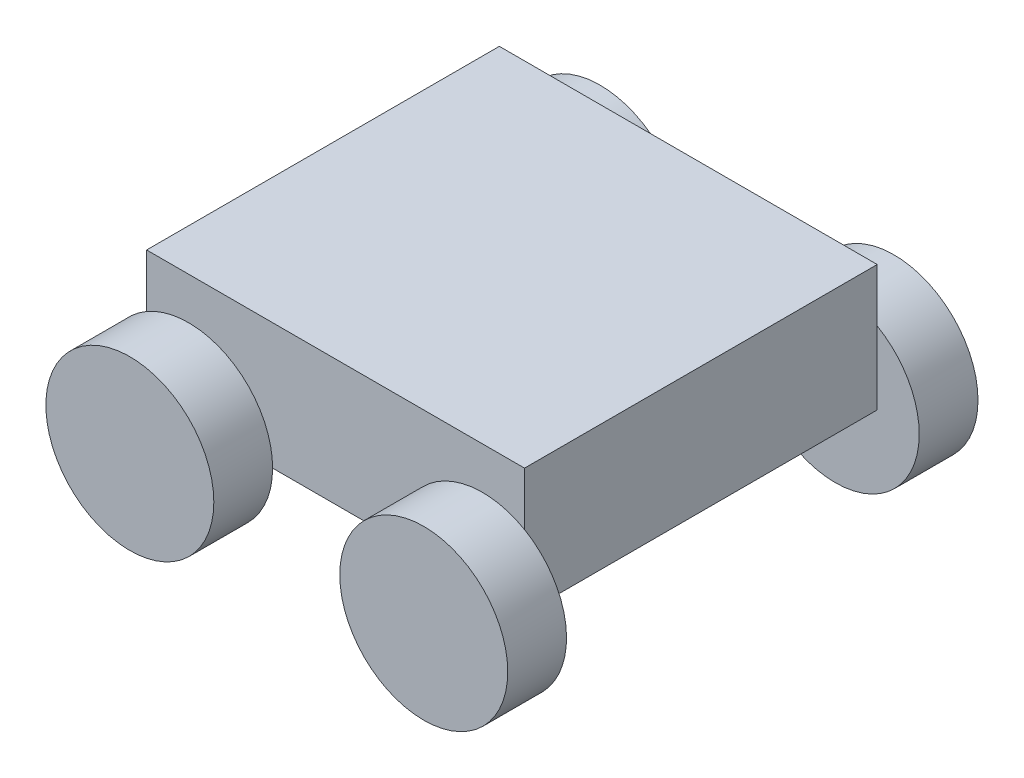
ISO-10303-21;
HEADER;
FILE_DESCRIPTION(('STEP AP214'),'2;1');
FILE_NAME('part.step','',(''),(''),'','','');
FILE_SCHEMA(('AUTOMOTIVE_DESIGN { 1 0 10303 214 1 1 1 1 }'));
ENDSEC;
DATA;
#1=APPLICATION_CONTEXT('core data for automotive mechanical design processes');
#2=APPLICATION_PROTOCOL_DEFINITION('international standard','automotive_design',2000,#1);
#3=PRODUCT_CONTEXT('',#1,'mechanical');
#4=PRODUCT('Part','Part','',(#3));
#5=PRODUCT_RELATED_PRODUCT_CATEGORY('part','',(#4));
#6=PRODUCT_DEFINITION_FORMATION('','',#4);
#7=PRODUCT_DEFINITION_CONTEXT('part definition',#1,'design');
#8=PRODUCT_DEFINITION('design','',#6,#7);
#9=PRODUCT_DEFINITION_SHAPE('','',#8);
#10=(LENGTH_UNIT() NAMED_UNIT(*) SI_UNIT(.MILLI.,.METRE.));
#11=(NAMED_UNIT(*) PLANE_ANGLE_UNIT() SI_UNIT($,.RADIAN.));
#12=(NAMED_UNIT(*) SI_UNIT($,.STERADIAN.) SOLID_ANGLE_UNIT());
#13=UNCERTAINTY_MEASURE_WITH_UNIT(LENGTH_MEASURE(1.E-05),#10,'distance_accuracy_value','');
#14=(GEOMETRIC_REPRESENTATION_CONTEXT(3) GLOBAL_UNCERTAINTY_ASSIGNED_CONTEXT((#13)) GLOBAL_UNIT_ASSIGNED_CONTEXT((#10,
#11,#12)) REPRESENTATION_CONTEXT('',''));
#15=CARTESIAN_POINT('',(0.,0.,0.));
#16=DIRECTION('',(0.,0.,1.));
#17=DIRECTION('',(1.,0.,0.));
#18=AXIS2_PLACEMENT_3D('',#15,#16,#17);
#19=CARTESIAN_POINT('',(225.,150.,-210.));
#20=DIRECTION('',(-1.,0.,0.));
#21=DIRECTION('',(0.,0.,1.));
#22=AXIS2_PLACEMENT_3D('',#19,#20,#21);
#23=PLANE('',#22);
#24=DIRECTION('',(0.,0.,-1.));
#25=VECTOR('',#24,1.);
#26=CARTESIAN_POINT('',(225.,0.,-210.));
#27=LINE('',#26,#25);
#28=CARTESIAN_POINT('',(225.,0.,210.));
#29=VERTEX_POINT('',#28);
#30=CARTESIAN_POINT('',(225.,0.,-210.));
#31=VERTEX_POINT('',#30);
#32=EDGE_CURVE('E127',#29,#31,#27,.T.);
#33=ORIENTED_EDGE('',*,*,#32,.T.);
#34=DIRECTION('',(0.,-1.,0.));
#35=VECTOR('',#34,1.);
#36=CARTESIAN_POINT('',(225.,150.,-210.));
#37=LINE('',#36,#35);
#38=CARTESIAN_POINT('',(225.,86.602540378444,-210.));
#39=VERTEX_POINT('',#38);
#40=EDGE_CURVE('E53',#39,#31,#37,.T.);
#41=ORIENTED_EDGE('',*,*,#40,.F.);
#42=CARTESIAN_POINT('',(225.,150.,-210.));
#43=VERTEX_POINT('',#42);
#44=EDGE_CURVE('E11',#43,#39,#37,.T.);
#45=ORIENTED_EDGE('',*,*,#44,.F.);
#46=DIRECTION('',(0.,0.,-1.));
#47=VECTOR('',#46,1.);
#48=CARTESIAN_POINT('',(225.,150.,-210.));
#49=LINE('',#48,#47);
#50=CARTESIAN_POINT('',(225.,150.,210.));
#51=VERTEX_POINT('',#50);
#52=EDGE_CURVE('E140',#51,#43,#49,.T.);
#53=ORIENTED_EDGE('',*,*,#52,.F.);
#54=DIRECTION('',(0.,-1.,0.));
#55=VECTOR('',#54,1.);
#56=CARTESIAN_POINT('',(225.,150.,210.));
#57=LINE('',#56,#55);
#58=CARTESIAN_POINT('',(225.,86.6025403784439,210.));
#59=VERTEX_POINT('',#58);
#60=EDGE_CURVE('E174',#51,#59,#57,.T.);
#61=ORIENTED_EDGE('',*,*,#60,.T.);
#62=EDGE_CURVE('E163',#59,#29,#57,.T.);
#63=ORIENTED_EDGE('',*,*,#62,.T.);
#64=EDGE_LOOP('',(#33,#41,#45,#53,#61,#63));
#65=FACE_BOUND('',#64,.T.);
#66=ADVANCED_FACE('F45',(#65),#23,.F.);
#67=CARTESIAN_POINT('',(-225.,150.,-210.));
#68=DIRECTION('',(0.,0.,1.));
#69=DIRECTION('',(1.,0.,0.));
#70=AXIS2_PLACEMENT_3D('',#67,#68,#69);
#71=PLANE('',#70);
#72=DIRECTION('',(-1.,0.,0.));
#73=VECTOR('',#72,1.);
#74=CARTESIAN_POINT('',(-225.,0.,-210.));
#75=LINE('',#74,#73);
#76=CARTESIAN_POINT('',(75.,0.,-210.));
#77=VERTEX_POINT('',#76);
#78=CARTESIAN_POINT('',(-75.,0.,-210.));
#79=VERTEX_POINT('',#78);
#80=EDGE_CURVE('E171',#77,#79,#75,.T.);
#81=ORIENTED_EDGE('',*,*,#80,.T.);
#82=CARTESIAN_POINT('',(-175.,0.,-210.));
#83=DIRECTION('',(0.,0.,1.));
#84=DIRECTION('',(1.,0.,0.));
#85=AXIS2_PLACEMENT_3D('',#82,#83,#84);
#86=CIRCLE('',#85,100.);
#87=CARTESIAN_POINT('',(-225.,86.6025403784438,-210.));
#88=VERTEX_POINT('',#87);
#89=EDGE_CURVE('E236',#79,#88,#86,.T.);
#90=ORIENTED_EDGE('',*,*,#89,.T.);
#91=DIRECTION('',(0.,-1.,0.));
#92=VECTOR('',#91,1.);
#93=CARTESIAN_POINT('',(-225.,150.,-210.));
#94=LINE('',#93,#92);
#95=CARTESIAN_POINT('',(-225.,150.,-210.));
#96=VERTEX_POINT('',#95);
#97=EDGE_CURVE('E129',#96,#88,#94,.T.);
#98=ORIENTED_EDGE('',*,*,#97,.F.);
#99=DIRECTION('',(-1.,0.,0.));
#100=VECTOR('',#99,1.);
#101=CARTESIAN_POINT('',(-225.,150.,-210.));
#102=LINE('',#101,#100);
#103=EDGE_CURVE('E132',#43,#96,#102,.T.);
#104=ORIENTED_EDGE('',*,*,#103,.F.);
#105=ORIENTED_EDGE('',*,*,#44,.T.);
#106=CARTESIAN_POINT('',(175.,0.,-210.));
#107=DIRECTION('',(0.,0.,1.));
#108=DIRECTION('',(1.,0.,0.));
#109=AXIS2_PLACEMENT_3D('',#106,#107,#108);
#110=CIRCLE('',#109,100.);
#111=EDGE_CURVE('E114',#39,#77,#110,.T.);
#112=ORIENTED_EDGE('',*,*,#111,.T.);
#113=EDGE_LOOP('',(#81,#90,#98,#104,#105,#112));
#114=FACE_BOUND('',#113,.T.);
#115=ADVANCED_FACE('F130',(#114),#71,.F.);
#116=CARTESIAN_POINT('',(-225.,150.,-210.));
#117=DIRECTION('',(1.,0.,0.));
#118=DIRECTION('',(0.,0.,-1.));
#119=AXIS2_PLACEMENT_3D('',#116,#117,#118);
#120=PLANE('',#119);
#121=DIRECTION('',(0.,0.,1.));
#122=VECTOR('',#121,1.);
#123=CARTESIAN_POINT('',(-225.,0.,-210.));
#124=LINE('',#123,#122);
#125=CARTESIAN_POINT('',(-225.,0.,-210.));
#126=VERTEX_POINT('',#125);
#127=CARTESIAN_POINT('',(-225.,0.,210.));
#128=VERTEX_POINT('',#127);
#129=EDGE_CURVE('E170',#126,#128,#124,.T.);
#130=ORIENTED_EDGE('',*,*,#129,.T.);
#131=DIRECTION('',(0.,-1.,0.));
#132=VECTOR('',#131,1.);
#133=CARTESIAN_POINT('',(-225.,150.,210.));
#134=LINE('',#133,#132);
#135=CARTESIAN_POINT('',(-225.,86.6025403784439,210.));
#136=VERTEX_POINT('',#135);
#137=EDGE_CURVE('E177',#136,#128,#134,.T.);
#138=ORIENTED_EDGE('',*,*,#137,.F.);
#139=CARTESIAN_POINT('',(-225.,150.,210.));
#140=VERTEX_POINT('',#139);
#141=EDGE_CURVE('E178',#140,#136,#134,.T.);
#142=ORIENTED_EDGE('',*,*,#141,.F.);
#143=DIRECTION('',(0.,0.,1.));
#144=VECTOR('',#143,1.);
#145=CARTESIAN_POINT('',(-225.,150.,-210.));
#146=LINE('',#145,#144);
#147=EDGE_CURVE('E139',#96,#140,#146,.T.);
#148=ORIENTED_EDGE('',*,*,#147,.F.);
#149=ORIENTED_EDGE('',*,*,#97,.T.);
#150=EDGE_CURVE('E180',#88,#126,#94,.T.);
#151=ORIENTED_EDGE('',*,*,#150,.T.);
#152=EDGE_LOOP('',(#130,#138,#142,#148,#149,#151));
#153=FACE_BOUND('',#152,.T.);
#154=ADVANCED_FACE('F186',(#153),#120,.F.);
#155=CARTESIAN_POINT('',(-225.,150.,210.));
#156=DIRECTION('',(0.,0.,-1.));
#157=DIRECTION('',(-1.,0.,0.));
#158=AXIS2_PLACEMENT_3D('',#155,#156,#157);
#159=PLANE('',#158);
#160=CARTESIAN_POINT('',(-175.,0.,210.));
#161=DIRECTION('',(0.,0.,1.));
#162=DIRECTION('',(1.,0.,0.));
#163=AXIS2_PLACEMENT_3D('',#160,#161,#162);
#164=CIRCLE('',#163,100.);
#165=CARTESIAN_POINT('',(-75.,0.,210.));
#166=VERTEX_POINT('',#165);
#167=EDGE_CURVE('E218',#166,#136,#164,.T.);
#168=ORIENTED_EDGE('',*,*,#167,.F.);
#169=DIRECTION('',(1.,0.,0.));
#170=VECTOR('',#169,1.);
#171=CARTESIAN_POINT('',(-225.,0.,210.));
#172=LINE('',#171,#170);
#173=CARTESIAN_POINT('',(75.,0.,210.));
#174=VERTEX_POINT('',#173);
#175=EDGE_CURVE('E152',#166,#174,#172,.T.);
#176=ORIENTED_EDGE('',*,*,#175,.T.);
#177=CARTESIAN_POINT('',(175.,0.,210.));
#178=DIRECTION('',(0.,0.,1.));
#179=DIRECTION('',(1.,0.,0.));
#180=AXIS2_PLACEMENT_3D('',#177,#178,#179);
#181=CIRCLE('',#180,100.);
#182=EDGE_CURVE('E217',#59,#174,#181,.T.);
#183=ORIENTED_EDGE('',*,*,#182,.F.);
#184=ORIENTED_EDGE('',*,*,#60,.F.);
#185=DIRECTION('',(1.,0.,0.));
#186=VECTOR('',#185,1.);
#187=CARTESIAN_POINT('',(-225.,150.,210.));
#188=LINE('',#187,#186);
#189=EDGE_CURVE('E144',#140,#51,#188,.T.);
#190=ORIENTED_EDGE('',*,*,#189,.F.);
#191=ORIENTED_EDGE('',*,*,#141,.T.);
#192=EDGE_LOOP('',(#168,#176,#183,#184,#190,#191));
#193=FACE_BOUND('',#192,.T.);
#194=ADVANCED_FACE('F216',(#193),#159,.F.);
#195=CARTESIAN_POINT('',(0.,150.,0.));
#196=DIRECTION('',(0.,1.,0.));
#197=DIRECTION('',(0.,0.,1.));
#198=AXIS2_PLACEMENT_3D('',#195,#196,#197);
#199=PLANE('',#198);
#200=ORIENTED_EDGE('',*,*,#52,.T.);
#201=ORIENTED_EDGE('',*,*,#103,.T.);
#202=ORIENTED_EDGE('',*,*,#147,.T.);
#203=ORIENTED_EDGE('',*,*,#189,.T.);
#204=EDGE_LOOP('',(#200,#201,#202,#203));
#205=FACE_BOUND('',#204,.T.);
#206=ADVANCED_FACE('F142',(#205),#199,.T.);
#207=CARTESIAN_POINT('',(0.,0.,0.));
#208=DIRECTION('',(0.,1.,0.));
#209=DIRECTION('',(0.,0.,1.));
#210=AXIS2_PLACEMENT_3D('',#207,#208,#209);
#211=PLANE('',#210);
#212=ORIENTED_EDGE('',*,*,#32,.F.);
#213=EDGE_CURVE('E154',#174,#29,#172,.T.);
#214=ORIENTED_EDGE('',*,*,#213,.F.);
#215=ORIENTED_EDGE('',*,*,#175,.F.);
#216=EDGE_CURVE('E148',#128,#166,#172,.T.);
#217=ORIENTED_EDGE('',*,*,#216,.F.);
#218=ORIENTED_EDGE('',*,*,#129,.F.);
#219=EDGE_CURVE('E166',#79,#126,#75,.T.);
#220=ORIENTED_EDGE('',*,*,#219,.F.);
#221=ORIENTED_EDGE('',*,*,#80,.F.);
#222=EDGE_CURVE('E111',#31,#77,#75,.T.);
#223=ORIENTED_EDGE('',*,*,#222,.F.);
#224=EDGE_LOOP('',(#212,#214,#215,#217,#218,#220,#221,#223));
#225=FACE_BOUND('',#224,.T.);
#226=ADVANCED_FACE('F192',(#225),#211,.F.);
#227=CARTESIAN_POINT('',(175.,0.,210.));
#228=DIRECTION('',(0.,0.,1.));
#229=DIRECTION('',(1.,0.,0.));
#230=AXIS2_PLACEMENT_3D('',#227,#228,#229);
#231=PLANE('',#230);
#232=EDGE_CURVE('E211',#174,#59,#181,.T.);
#233=ORIENTED_EDGE('',*,*,#232,.F.);
#234=ORIENTED_EDGE('',*,*,#213,.T.);
#235=ORIENTED_EDGE('',*,*,#62,.F.);
#236=EDGE_LOOP('',(#233,#234,#235));
#237=FACE_BOUND('',#236,.T.);
#238=ADVANCED_FACE('F210',(#237),#231,.F.);
#239=CARTESIAN_POINT('',(175.,0.,280.));
#240=DIRECTION('',(0.,0.,-1.));
#241=DIRECTION('',(-1.,0.,0.));
#242=AXIS2_PLACEMENT_3D('',#239,#240,#241);
#243=CYLINDRICAL_SURFACE('',#242,100.);
#244=CARTESIAN_POINT('',(175.,0.,280.));
#245=DIRECTION('',(0.,0.,1.));
#246=DIRECTION('',(1.,0.,0.));
#247=AXIS2_PLACEMENT_3D('',#244,#245,#246);
#248=CIRCLE('',#247,100.);
#249=CARTESIAN_POINT('',(275.,0.,280.));
#250=VERTEX_POINT('',#249);
#251=EDGE_CURVE('E156',#250,#250,#248,.T.);
#252=ORIENTED_EDGE('',*,*,#251,.F.);
#253=EDGE_LOOP('',(#252));
#254=FACE_BOUND('',#253,.T.);
#255=ORIENTED_EDGE('',*,*,#182,.T.);
#256=ORIENTED_EDGE('',*,*,#232,.T.);
#257=EDGE_LOOP('',(#255,#256));
#258=FACE_BOUND('',#257,.T.);
#259=ADVANCED_FACE('F283',(#254,#258),#243,.T.);
#260=CARTESIAN_POINT('',(175.,0.,280.));
#261=DIRECTION('',(0.,0.,1.));
#262=DIRECTION('',(1.,0.,0.));
#263=AXIS2_PLACEMENT_3D('',#260,#261,#262);
#264=PLANE('',#263);
#265=ORIENTED_EDGE('',*,*,#251,.T.);
#266=EDGE_LOOP('',(#265));
#267=FACE_BOUND('',#266,.T.);
#268=ADVANCED_FACE('F280',(#267),#264,.T.);
#269=CARTESIAN_POINT('',(-175.,0.,210.));
#270=DIRECTION('',(0.,0.,1.));
#271=DIRECTION('',(1.,0.,0.));
#272=AXIS2_PLACEMENT_3D('',#269,#270,#271);
#273=PLANE('',#272);
#274=ORIENTED_EDGE('',*,*,#137,.T.);
#275=ORIENTED_EDGE('',*,*,#216,.T.);
#276=EDGE_CURVE('E200',#136,#166,#164,.T.);
#277=ORIENTED_EDGE('',*,*,#276,.F.);
#278=EDGE_LOOP('',(#274,#275,#277));
#279=FACE_BOUND('',#278,.T.);
#280=ADVANCED_FACE('F199',(#279),#273,.F.);
#281=CARTESIAN_POINT('',(-175.,0.,280.));
#282=DIRECTION('',(0.,0.,-1.));
#283=DIRECTION('',(-1.,0.,0.));
#284=AXIS2_PLACEMENT_3D('',#281,#282,#283);
#285=CYLINDRICAL_SURFACE('',#284,100.);
#286=CARTESIAN_POINT('',(-175.,0.,280.));
#287=DIRECTION('',(0.,0.,1.));
#288=DIRECTION('',(1.,0.,0.));
#289=AXIS2_PLACEMENT_3D('',#286,#287,#288);
#290=CIRCLE('',#289,100.);
#291=CARTESIAN_POINT('',(-75.,0.,280.));
#292=VERTEX_POINT('',#291);
#293=EDGE_CURVE('E167',#292,#292,#290,.T.);
#294=ORIENTED_EDGE('',*,*,#293,.F.);
#295=EDGE_LOOP('',(#294));
#296=FACE_BOUND('',#295,.T.);
#297=ORIENTED_EDGE('',*,*,#167,.T.);
#298=ORIENTED_EDGE('',*,*,#276,.T.);
#299=EDGE_LOOP('',(#297,#298));
#300=FACE_BOUND('',#299,.T.);
#301=ADVANCED_FACE('F289',(#296,#300),#285,.T.);
#302=CARTESIAN_POINT('',(-175.,0.,280.));
#303=DIRECTION('',(0.,0.,1.));
#304=DIRECTION('',(1.,0.,0.));
#305=AXIS2_PLACEMENT_3D('',#302,#303,#304);
#306=PLANE('',#305);
#307=ORIENTED_EDGE('',*,*,#293,.T.);
#308=EDGE_LOOP('',(#307));
#309=FACE_BOUND('',#308,.T.);
#310=ADVANCED_FACE('F292',(#309),#306,.T.);
#311=CARTESIAN_POINT('',(175.,0.,-210.));
#312=DIRECTION('',(0.,0.,-1.));
#313=DIRECTION('',(1.,0.,0.));
#314=AXIS2_PLACEMENT_3D('',#311,#312,#313);
#315=PLANE('',#314);
#316=ORIENTED_EDGE('',*,*,#40,.T.);
#317=ORIENTED_EDGE('',*,*,#222,.T.);
#318=EDGE_CURVE('E66',#77,#39,#110,.T.);
#319=ORIENTED_EDGE('',*,*,#318,.T.);
#320=EDGE_LOOP('',(#316,#317,#319));
#321=FACE_BOUND('',#320,.T.);
#322=ADVANCED_FACE('F108',(#321),#315,.F.);
#323=CARTESIAN_POINT('',(175.,0.,-280.));
#324=DIRECTION('',(0.,0.,1.));
#325=DIRECTION('',(1.,0.,0.));
#326=AXIS2_PLACEMENT_3D('',#323,#324,#325);
#327=CYLINDRICAL_SURFACE('',#326,100.);
#328=CARTESIAN_POINT('',(175.,0.,-280.));
#329=DIRECTION('',(0.,0.,1.));
#330=DIRECTION('',(1.,0.,0.));
#331=AXIS2_PLACEMENT_3D('',#328,#329,#330);
#332=CIRCLE('',#331,100.);
#333=CARTESIAN_POINT('',(275.,0.,-280.));
#334=VERTEX_POINT('',#333);
#335=EDGE_CURVE('E121',#334,#334,#332,.T.);
#336=ORIENTED_EDGE('',*,*,#335,.T.);
#337=EDGE_LOOP('',(#336));
#338=FACE_BOUND('',#337,.T.);
#339=ORIENTED_EDGE('',*,*,#111,.F.);
#340=ORIENTED_EDGE('',*,*,#318,.F.);
#341=EDGE_LOOP('',(#339,#340));
#342=FACE_BOUND('',#341,.T.);
#343=ADVANCED_FACE('F116',(#338,#342),#327,.T.);
#344=CARTESIAN_POINT('',(175.,0.,-280.));
#345=DIRECTION('',(0.,0.,-1.));
#346=DIRECTION('',(1.,0.,0.));
#347=AXIS2_PLACEMENT_3D('',#344,#345,#346);
#348=PLANE('',#347);
#349=ORIENTED_EDGE('',*,*,#335,.F.);
#350=EDGE_LOOP('',(#349));
#351=FACE_BOUND('',#350,.T.);
#352=ADVANCED_FACE('F261',(#351),#348,.T.);
#353=CARTESIAN_POINT('',(-175.,0.,-210.));
#354=DIRECTION('',(0.,0.,-1.));
#355=DIRECTION('',(1.,0.,0.));
#356=AXIS2_PLACEMENT_3D('',#353,#354,#355);
#357=PLANE('',#356);
#358=EDGE_CURVE('E59',#88,#79,#86,.T.);
#359=ORIENTED_EDGE('',*,*,#358,.T.);
#360=ORIENTED_EDGE('',*,*,#219,.T.);
#361=ORIENTED_EDGE('',*,*,#150,.F.);
#362=EDGE_LOOP('',(#359,#360,#361));
#363=FACE_BOUND('',#362,.T.);
#364=ADVANCED_FACE('F248',(#363),#357,.F.);
#365=CARTESIAN_POINT('',(-175.,0.,-280.));
#366=DIRECTION('',(0.,0.,1.));
#367=DIRECTION('',(1.,0.,0.));
#368=AXIS2_PLACEMENT_3D('',#365,#366,#367);
#369=CYLINDRICAL_SURFACE('',#368,100.);
#370=CARTESIAN_POINT('',(-175.,0.,-280.));
#371=DIRECTION('',(0.,0.,1.));
#372=DIRECTION('',(1.,0.,0.));
#373=AXIS2_PLACEMENT_3D('',#370,#371,#372);
#374=CIRCLE('',#373,100.);
#375=CARTESIAN_POINT('',(-75.,0.,-280.));
#376=VERTEX_POINT('',#375);
#377=EDGE_CURVE('E231',#376,#376,#374,.T.);
#378=ORIENTED_EDGE('',*,*,#377,.T.);
#379=EDGE_LOOP('',(#378));
#380=FACE_BOUND('',#379,.T.);
#381=ORIENTED_EDGE('',*,*,#89,.F.);
#382=ORIENTED_EDGE('',*,*,#358,.F.);
#383=EDGE_LOOP('',(#381,#382));
#384=FACE_BOUND('',#383,.T.);
#385=ADVANCED_FACE('F249',(#380,#384),#369,.T.);
#386=CARTESIAN_POINT('',(-175.,0.,-280.));
#387=DIRECTION('',(0.,0.,-1.));
#388=DIRECTION('',(1.,0.,0.));
#389=AXIS2_PLACEMENT_3D('',#386,#387,#388);
#390=PLANE('',#389);
#391=ORIENTED_EDGE('',*,*,#377,.F.);
#392=EDGE_LOOP('',(#391));
#393=FACE_BOUND('',#392,.T.);
#394=ADVANCED_FACE('F253',(#393),#390,.T.);
#395=CLOSED_SHELL('',(#66,#115,#154,#194,#206,#226,#238,#259,#268,#280,#301,#310,#322,#343,#352,
#364,#385,#394));
#396=MANIFOLD_SOLID_BREP('B2',#395);
#397=ADVANCED_BREP_SHAPE_REPRESENTATION('',(#18,#396),#14);
#398=SHAPE_DEFINITION_REPRESENTATION(#9,#397);
ENDSEC;
END-ISO-10303-21;
